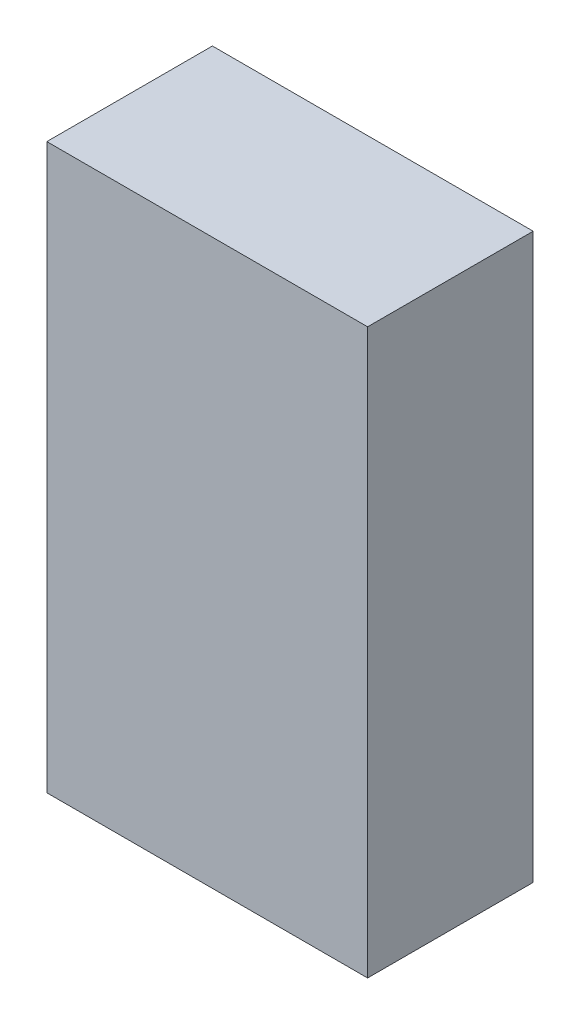
ISO-10303-21;
HEADER;
FILE_DESCRIPTION(('STEP AP214'),'2;1');
FILE_NAME('part.step','',(''),(''),'','','');
FILE_SCHEMA(('AUTOMOTIVE_DESIGN { 1 0 10303 214 1 1 1 1 }'));
ENDSEC;
DATA;
#1=APPLICATION_CONTEXT('core data for automotive mechanical design processes');
#2=APPLICATION_PROTOCOL_DEFINITION('international standard','automotive_design',2000,#1);
#3=PRODUCT_CONTEXT('',#1,'mechanical');
#4=PRODUCT('Part','Part','',(#3));
#5=PRODUCT_RELATED_PRODUCT_CATEGORY('part','',(#4));
#6=PRODUCT_DEFINITION_FORMATION('','',#4);
#7=PRODUCT_DEFINITION_CONTEXT('part definition',#1,'design');
#8=PRODUCT_DEFINITION('design','',#6,#7);
#9=PRODUCT_DEFINITION_SHAPE('','',#8);
#10=(LENGTH_UNIT() NAMED_UNIT(*) SI_UNIT(.MILLI.,.METRE.));
#11=(NAMED_UNIT(*) PLANE_ANGLE_UNIT() SI_UNIT($,.RADIAN.));
#12=(NAMED_UNIT(*) SI_UNIT($,.STERADIAN.) SOLID_ANGLE_UNIT());
#13=UNCERTAINTY_MEASURE_WITH_UNIT(LENGTH_MEASURE(1.E-05),#10,'distance_accuracy_value','');
#14=(GEOMETRIC_REPRESENTATION_CONTEXT(3) GLOBAL_UNCERTAINTY_ASSIGNED_CONTEXT((#13)) GLOBAL_UNIT_ASSIGNED_CONTEXT((#10,
#11,#12)) REPRESENTATION_CONTEXT('',''));
#15=CARTESIAN_POINT('',(0.,0.,0.));
#16=DIRECTION('',(0.,0.,1.));
#17=DIRECTION('',(1.,0.,0.));
#18=AXIS2_PLACEMENT_3D('',#15,#16,#17);
#19=CARTESIAN_POINT('',(-31.,54.5,-16.));
#20=DIRECTION('',(-1.,0.,0.));
#21=DIRECTION('',(0.,0.,1.));
#22=AXIS2_PLACEMENT_3D('',#19,#20,#21);
#23=PLANE('',#22);
#24=DIRECTION('',(0.,0.,1.));
#25=VECTOR('',#24,1.);
#26=CARTESIAN_POINT('',(-31.,-54.5,-16.));
#27=LINE('',#26,#25);
#28=CARTESIAN_POINT('',(-31.,-54.5,-16.));
#29=VERTEX_POINT('',#28);
#30=CARTESIAN_POINT('',(-31.,-54.5,16.));
#31=VERTEX_POINT('',#30);
#32=EDGE_CURVE('E40',#29,#31,#27,.T.);
#33=ORIENTED_EDGE('',*,*,#32,.T.);
#34=DIRECTION('',(0.,-1.,0.));
#35=VECTOR('',#34,1.);
#36=CARTESIAN_POINT('',(-31.,54.5,16.));
#37=LINE('',#36,#35);
#38=CARTESIAN_POINT('',(-31.,54.5,16.));
#39=VERTEX_POINT('',#38);
#40=EDGE_CURVE('E77',#39,#31,#37,.T.);
#41=ORIENTED_EDGE('',*,*,#40,.F.);
#42=DIRECTION('',(0.,0.,1.));
#43=VECTOR('',#42,1.);
#44=CARTESIAN_POINT('',(-31.,54.5,-16.));
#45=LINE('',#44,#43);
#46=CARTESIAN_POINT('',(-31.,54.5,-16.));
#47=VERTEX_POINT('',#46);
#48=EDGE_CURVE('E11',#47,#39,#45,.T.);
#49=ORIENTED_EDGE('',*,*,#48,.F.);
#50=DIRECTION('',(0.,-1.,0.));
#51=VECTOR('',#50,1.);
#52=CARTESIAN_POINT('',(-31.,54.5,-16.));
#53=LINE('',#52,#51);
#54=EDGE_CURVE('E78',#47,#29,#53,.T.);
#55=ORIENTED_EDGE('',*,*,#54,.T.);
#56=EDGE_LOOP('',(#33,#41,#49,#55));
#57=FACE_BOUND('',#56,.T.);
#58=ADVANCED_FACE('F37',(#57),#23,.T.);
#59=CARTESIAN_POINT('',(31.,54.5,-16.));
#60=DIRECTION('',(0.,1.,0.));
#61=DIRECTION('',(0.,0.,1.));
#62=AXIS2_PLACEMENT_3D('',#59,#60,#61);
#63=PLANE('',#62);
#64=ORIENTED_EDGE('',*,*,#48,.T.);
#65=DIRECTION('',(-1.,0.,0.));
#66=VECTOR('',#65,1.);
#67=CARTESIAN_POINT('',(31.,54.5,16.));
#68=LINE('',#67,#66);
#69=CARTESIAN_POINT('',(31.,54.5,16.));
#70=VERTEX_POINT('',#69);
#71=EDGE_CURVE('E94',#70,#39,#68,.T.);
#72=ORIENTED_EDGE('',*,*,#71,.F.);
#73=DIRECTION('',(0.,0.,1.));
#74=VECTOR('',#73,1.);
#75=CARTESIAN_POINT('',(31.,54.5,-16.));
#76=LINE('',#75,#74);
#77=CARTESIAN_POINT('',(31.,54.5,-16.));
#78=VERTEX_POINT('',#77);
#79=EDGE_CURVE('E45',#78,#70,#76,.T.);
#80=ORIENTED_EDGE('',*,*,#79,.F.);
#81=DIRECTION('',(-1.,0.,0.));
#82=VECTOR('',#81,1.);
#83=CARTESIAN_POINT('',(31.,54.5,-16.));
#84=LINE('',#83,#82);
#85=EDGE_CURVE('E83',#78,#47,#84,.T.);
#86=ORIENTED_EDGE('',*,*,#85,.T.);
#87=EDGE_LOOP('',(#64,#72,#80,#86));
#88=FACE_BOUND('',#87,.T.);
#89=ADVANCED_FACE('F109',(#88),#63,.T.);
#90=CARTESIAN_POINT('',(31.,54.5,-16.));
#91=DIRECTION('',(1.,0.,0.));
#92=DIRECTION('',(0.,0.,-1.));
#93=AXIS2_PLACEMENT_3D('',#90,#91,#92);
#94=PLANE('',#93);
#95=ORIENTED_EDGE('',*,*,#79,.T.);
#96=DIRECTION('',(0.,1.,0.));
#97=VECTOR('',#96,1.);
#98=CARTESIAN_POINT('',(31.,54.5,16.));
#99=LINE('',#98,#97);
#100=CARTESIAN_POINT('',(31.,-54.5,16.));
#101=VERTEX_POINT('',#100);
#102=EDGE_CURVE('E90',#101,#70,#99,.T.);
#103=ORIENTED_EDGE('',*,*,#102,.F.);
#104=DIRECTION('',(0.,0.,1.));
#105=VECTOR('',#104,1.);
#106=CARTESIAN_POINT('',(31.,-54.5,-16.));
#107=LINE('',#106,#105);
#108=CARTESIAN_POINT('',(31.,-54.5,-16.));
#109=VERTEX_POINT('',#108);
#110=EDGE_CURVE('E82',#109,#101,#107,.T.);
#111=ORIENTED_EDGE('',*,*,#110,.F.);
#112=DIRECTION('',(0.,1.,0.));
#113=VECTOR('',#112,1.);
#114=CARTESIAN_POINT('',(31.,54.5,-16.));
#115=LINE('',#114,#113);
#116=EDGE_CURVE('E102',#109,#78,#115,.T.);
#117=ORIENTED_EDGE('',*,*,#116,.T.);
#118=EDGE_LOOP('',(#95,#103,#111,#117));
#119=FACE_BOUND('',#118,.T.);
#120=ADVANCED_FACE('F106',(#119),#94,.T.);
#121=CARTESIAN_POINT('',(31.,-54.5,-16.));
#122=DIRECTION('',(0.,-1.,0.));
#123=DIRECTION('',(0.,0.,-1.));
#124=AXIS2_PLACEMENT_3D('',#121,#122,#123);
#125=PLANE('',#124);
#126=ORIENTED_EDGE('',*,*,#110,.T.);
#127=DIRECTION('',(1.,0.,0.));
#128=VECTOR('',#127,1.);
#129=CARTESIAN_POINT('',(31.,-54.5,16.));
#130=LINE('',#129,#128);
#131=EDGE_CURVE('E85',#31,#101,#130,.T.);
#132=ORIENTED_EDGE('',*,*,#131,.F.);
#133=ORIENTED_EDGE('',*,*,#32,.F.);
#134=DIRECTION('',(1.,0.,0.));
#135=VECTOR('',#134,1.);
#136=CARTESIAN_POINT('',(31.,-54.5,-16.));
#137=LINE('',#136,#135);
#138=EDGE_CURVE('E100',#29,#109,#137,.T.);
#139=ORIENTED_EDGE('',*,*,#138,.T.);
#140=EDGE_LOOP('',(#126,#132,#133,#139));
#141=FACE_BOUND('',#140,.T.);
#142=ADVANCED_FACE('F86',(#141),#125,.T.);
#143=CARTESIAN_POINT('',(0.,0.,-16.));
#144=DIRECTION('',(0.,0.,-1.));
#145=DIRECTION('',(-1.,0.,0.));
#146=AXIS2_PLACEMENT_3D('',#143,#144,#145);
#147=PLANE('',#146);
#148=ORIENTED_EDGE('',*,*,#54,.F.);
#149=ORIENTED_EDGE('',*,*,#85,.F.);
#150=ORIENTED_EDGE('',*,*,#116,.F.);
#151=ORIENTED_EDGE('',*,*,#138,.F.);
#152=EDGE_LOOP('',(#148,#149,#150,#151));
#153=FACE_BOUND('',#152,.T.);
#154=ADVANCED_FACE('F111',(#153),#147,.T.);
#155=CARTESIAN_POINT('',(0.,0.,16.));
#156=DIRECTION('',(0.,0.,-1.));
#157=DIRECTION('',(-1.,0.,0.));
#158=AXIS2_PLACEMENT_3D('',#155,#156,#157);
#159=PLANE('',#158);
#160=ORIENTED_EDGE('',*,*,#40,.T.);
#161=ORIENTED_EDGE('',*,*,#131,.T.);
#162=ORIENTED_EDGE('',*,*,#102,.T.);
#163=ORIENTED_EDGE('',*,*,#71,.T.);
#164=EDGE_LOOP('',(#160,#161,#162,#163));
#165=FACE_BOUND('',#164,.T.);
#166=ADVANCED_FACE('F93',(#165),#159,.F.);
#167=CLOSED_SHELL('',(#58,#89,#120,#142,#154,#166));
#168=MANIFOLD_SOLID_BREP('B2',#167);
#169=ADVANCED_BREP_SHAPE_REPRESENTATION('',(#18,#168),#14);
#170=SHAPE_DEFINITION_REPRESENTATION(#9,#169);
ENDSEC;
END-ISO-10303-21;
